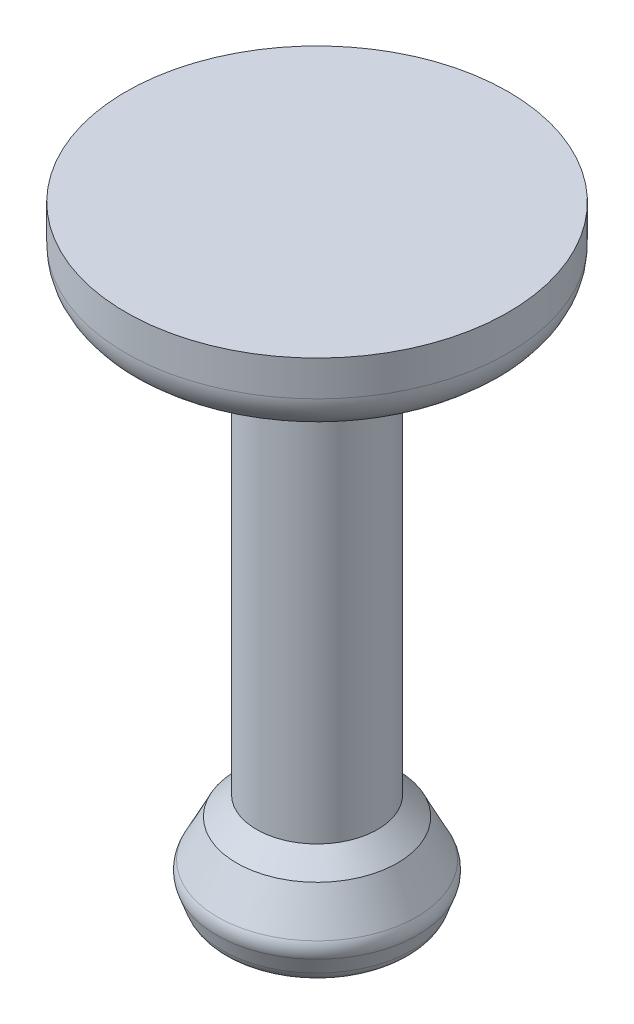
ISO-10303-21;
HEADER;
FILE_DESCRIPTION(('STEP AP214'),'2;1');
FILE_NAME('part.step','',(''),(''),'','','');
FILE_SCHEMA(('AUTOMOTIVE_DESIGN { 1 0 10303 214 1 1 1 1 }'));
ENDSEC;
DATA;
#1=APPLICATION_CONTEXT('core data for automotive mechanical design processes');
#2=APPLICATION_PROTOCOL_DEFINITION('international standard','automotive_design',2000,#1);
#3=PRODUCT_CONTEXT('',#1,'mechanical');
#4=PRODUCT('Part','Part','',(#3));
#5=PRODUCT_RELATED_PRODUCT_CATEGORY('part','',(#4));
#6=PRODUCT_DEFINITION_FORMATION('','',#4);
#7=PRODUCT_DEFINITION_CONTEXT('part definition',#1,'design');
#8=PRODUCT_DEFINITION('design','',#6,#7);
#9=PRODUCT_DEFINITION_SHAPE('','',#8);
#10=(LENGTH_UNIT() NAMED_UNIT(*) SI_UNIT(.MILLI.,.METRE.));
#11=(NAMED_UNIT(*) PLANE_ANGLE_UNIT() SI_UNIT($,.RADIAN.));
#12=(NAMED_UNIT(*) SI_UNIT($,.STERADIAN.) SOLID_ANGLE_UNIT());
#13=UNCERTAINTY_MEASURE_WITH_UNIT(LENGTH_MEASURE(1.E-05),#10,'distance_accuracy_value','');
#14=(GEOMETRIC_REPRESENTATION_CONTEXT(3) GLOBAL_UNCERTAINTY_ASSIGNED_CONTEXT((#13)) GLOBAL_UNIT_ASSIGNED_CONTEXT((#10,
#11,#12)) REPRESENTATION_CONTEXT('',''));
#15=CARTESIAN_POINT('',(0.,0.,0.));
#16=DIRECTION('',(0.,0.,1.));
#17=DIRECTION('',(1.,0.,0.));
#18=AXIS2_PLACEMENT_3D('',#15,#16,#17);
#19=CARTESIAN_POINT('',(-16.3863572176765,31.4329979687884,0.));
#20=DIRECTION('',(0.,-1.,0.));
#21=DIRECTION('',(0.,0.,-1.));
#22=AXIS2_PLACEMENT_3D('',#19,#20,#21);
#23=TOROIDAL_SURFACE('',#22,10.139599792567,2.54);
#24=CARTESIAN_POINT('',(-16.3863572176765,28.9227525536501,0.));
#25=DIRECTION('',(0.,-1.,0.));
#26=DIRECTION('',(0.,0.,-1.));
#27=AXIS2_PLACEMENT_3D('',#24,#25,#26);
#28=CIRCLE('',#27,10.5272439022569);
#29=CARTESIAN_POINT('',(-16.3863572176765,28.9227525536501,-10.5272439022569));
#30=VERTEX_POINT('',#29);
#31=EDGE_CURVE('E83',#30,#30,#28,.T.);
#32=ORIENTED_EDGE('',*,*,#31,.F.);
#33=EDGE_LOOP('',(#32));
#34=FACE_BOUND('',#33,.T.);
#35=CARTESIAN_POINT('',(-16.3863572176765,31.4329979687884,0.));
#36=DIRECTION('',(0.,-1.,0.));
#37=DIRECTION('',(0.,0.,-1.));
#38=AXIS2_PLACEMENT_3D('',#35,#36,#37);
#39=CIRCLE('',#38,12.679599792567);
#40=CARTESIAN_POINT('',(-16.3863572176765,31.4329979687884,-12.679599792567));
#41=VERTEX_POINT('',#40);
#42=EDGE_CURVE('E10',#41,#41,#39,.T.);
#43=ORIENTED_EDGE('',*,*,#42,.T.);
#44=EDGE_LOOP('',(#43));
#45=FACE_BOUND('',#44,.T.);
#46=ADVANCED_FACE('F31',(#34,#45),#23,.T.);
#47=CARTESIAN_POINT('',(-16.3863572176765,-3.05281870995184,0.));
#48=DIRECTION('',(0.,-1.,0.));
#49=DIRECTION('',(0.,0.,-1.));
#50=AXIS2_PLACEMENT_3D('',#47,#48,#49);
#51=CYLINDRICAL_SURFACE('',#50,12.679599792567);
#52=ORIENTED_EDGE('',*,*,#42,.F.);
#53=EDGE_LOOP('',(#52));
#54=FACE_BOUND('',#53,.T.);
#55=CARTESIAN_POINT('',(-16.3863572176765,33.7771812900482,0.));
#56=DIRECTION('',(0.,-1.,0.));
#57=DIRECTION('',(0.,0.,-1.));
#58=AXIS2_PLACEMENT_3D('',#55,#56,#57);
#59=CIRCLE('',#58,12.679599792567);
#60=CARTESIAN_POINT('',(-16.3863572176765,33.7771812900482,-12.679599792567));
#61=VERTEX_POINT('',#60);
#62=EDGE_CURVE('E37',#61,#61,#59,.T.);
#63=ORIENTED_EDGE('',*,*,#62,.T.);
#64=EDGE_LOOP('',(#63));
#65=FACE_BOUND('',#64,.T.);
#66=ADVANCED_FACE('F90',(#54,#65),#51,.T.);
#67=CARTESIAN_POINT('',(-16.3863572176765,33.7771812900482,0.));
#68=DIRECTION('',(0.,-1.,0.));
#69=DIRECTION('',(0.,0.,-1.));
#70=AXIS2_PLACEMENT_3D('',#67,#68,#69);
#71=PLANE('',#70);
#72=ORIENTED_EDGE('',*,*,#62,.F.);
#73=EDGE_LOOP('',(#72));
#74=FACE_BOUND('',#73,.T.);
#75=ADVANCED_FACE('F94',(#74),#71,.F.);
#76=CARTESIAN_POINT('',(-18.7859370531128,-3.05281870995184,0.));
#77=DIRECTION('',(0.,1.,0.));
#78=DIRECTION('',(0.,0.,1.));
#79=AXIS2_PLACEMENT_3D('',#76,#77,#78);
#80=PLANE('',#79);
#81=CARTESIAN_POINT('',(-16.3863572176765,-3.05281870995184,0.));
#82=DIRECTION('',(0.,-1.,0.));
#83=DIRECTION('',(0.,0.,-1.));
#84=AXIS2_PLACEMENT_3D('',#81,#82,#83);
#85=CIRCLE('',#84,2.39957983543637);
#86=CARTESIAN_POINT('',(-16.3863572176765,-3.05281870995184,-2.39957983543637));
#87=VERTEX_POINT('',#86);
#88=EDGE_CURVE('E41',#87,#87,#85,.T.);
#89=ORIENTED_EDGE('',*,*,#88,.T.);
#90=EDGE_LOOP('',(#89));
#91=FACE_BOUND('',#90,.T.);
#92=ADVANCED_FACE('F99',(#91),#80,.F.);
#93=CARTESIAN_POINT('',(-16.3863572176765,-4.32281870995184,0.));
#94=DIRECTION('',(0.,-1.,0.));
#95=DIRECTION('',(0.,0.,-1.));
#96=AXIS2_PLACEMENT_3D('',#93,#94,#95);
#97=TOROIDAL_SURFACE('',#96,2.39957983543638,1.27);
#98=ORIENTED_EDGE('',*,*,#88,.F.);
#99=EDGE_LOOP('',(#98));
#100=FACE_BOUND('',#99,.T.);
#101=CARTESIAN_POINT('',(-16.3863572176765,-3.90500514014736,0.));
#102=DIRECTION('',(0.,-1.,0.));
#103=DIRECTION('',(0.,0.,-1.));
#104=AXIS2_PLACEMENT_3D('',#101,#102,#103);
#105=CIRCLE('',#104,3.59888455938573);
#106=CARTESIAN_POINT('',(-16.3863572176765,-3.90500514014736,-3.59888455938573));
#107=VERTEX_POINT('',#106);
#108=EDGE_CURVE('E45',#107,#107,#105,.T.);
#109=ORIENTED_EDGE('',*,*,#108,.T.);
#110=EDGE_LOOP('',(#109));
#111=FACE_BOUND('',#110,.T.);
#112=ADVANCED_FACE('F105',(#100,#111),#97,.F.);
#113=CARTESIAN_POINT('',(-16.3863572176765,-4.64571703432303,0.));
#114=DIRECTION('',(0.,-1.,0.));
#115=DIRECTION('',(0.,0.,-1.));
#116=AXIS2_PLACEMENT_3D('',#113,#114,#115);
#117=CONICAL_SURFACE('',#116,3.85693363942525,0.335230727804483);
#118=ORIENTED_EDGE('',*,*,#108,.F.);
#119=EDGE_LOOP('',(#118));
#120=FACE_BOUND('',#119,.T.);
#121=CARTESIAN_POINT('',(-16.3863572176765,-4.64571703432303,0.));
#122=DIRECTION('',(0.,-1.,0.));
#123=DIRECTION('',(0.,0.,-1.));
#124=AXIS2_PLACEMENT_3D('',#121,#122,#123);
#125=CIRCLE('',#124,3.85693363942525);
#126=CARTESIAN_POINT('',(-16.3863572176765,-4.64571703432303,-3.85693363942525));
#127=VERTEX_POINT('',#126);
#128=EDGE_CURVE('E50',#127,#127,#125,.T.);
#129=ORIENTED_EDGE('',*,*,#128,.T.);
#130=EDGE_LOOP('',(#129));
#131=FACE_BOUND('',#130,.T.);
#132=ADVANCED_FACE('F109',(#120,#131),#117,.F.);
#133=CARTESIAN_POINT('',(-16.3863572176765,-5.06353060412752,0.));
#134=DIRECTION('',(0.,-1.,0.));
#135=DIRECTION('',(0.,0.,-1.));
#136=AXIS2_PLACEMENT_3D('',#133,#134,#135);
#137=TOROIDAL_SURFACE('',#136,2.6576289154759,1.27);
#138=ORIENTED_EDGE('',*,*,#128,.F.);
#139=EDGE_LOOP('',(#138));
#140=FACE_BOUND('',#139,.T.);
#141=CARTESIAN_POINT('',(-16.3863572176765,-5.68654307011768,0.));
#142=DIRECTION('',(0.,-1.,0.));
#143=DIRECTION('',(0.,0.,-1.));
#144=AXIS2_PLACEMENT_3D('',#141,#142,#143);
#145=CIRCLE('',#144,3.76431562237215);
#146=CARTESIAN_POINT('',(-16.3863572176765,-5.68654307011768,-3.76431562237215));
#147=VERTEX_POINT('',#146);
#148=EDGE_CURVE('E53',#147,#147,#145,.T.);
#149=ORIENTED_EDGE('',*,*,#148,.T.);
#150=EDGE_LOOP('',(#149));
#151=FACE_BOUND('',#150,.T.);
#152=ADVANCED_FACE('F113',(#140,#151),#137,.F.);
#153=CARTESIAN_POINT('',(-16.3863572176765,-6.92454374172193,0.));
#154=DIRECTION('',(0.,1.,0.));
#155=DIRECTION('',(0.,0.,1.));
#156=AXIS2_PLACEMENT_3D('',#153,#154,#155);
#157=CONICAL_SURFACE('',#156,3.06737958211125,0.512733419272507);
#158=ORIENTED_EDGE('',*,*,#148,.F.);
#159=EDGE_LOOP('',(#158));
#160=FACE_BOUND('',#159,.T.);
#161=CARTESIAN_POINT('',(-16.3863572176765,-6.92454374172193,0.));
#162=DIRECTION('',(0.,-1.,0.));
#163=DIRECTION('',(0.,0.,-1.));
#164=AXIS2_PLACEMENT_3D('',#161,#162,#163);
#165=CIRCLE('',#164,3.06737958211125);
#166=CARTESIAN_POINT('',(-16.3863572176765,-6.92454374172193,-3.06737958211125));
#167=VERTEX_POINT('',#166);
#168=EDGE_CURVE('E56',#167,#167,#165,.T.);
#169=ORIENTED_EDGE('',*,*,#168,.T.);
#170=EDGE_LOOP('',(#169));
#171=FACE_BOUND('',#170,.T.);
#172=ADVANCED_FACE('F117',(#160,#171),#157,.F.);
#173=CARTESIAN_POINT('',(-19.4537367997877,-6.92454374172193,0.));
#174=DIRECTION('',(0.,1.,0.));
#175=DIRECTION('',(0.,0.,1.));
#176=AXIS2_PLACEMENT_3D('',#173,#174,#175);
#177=PLANE('',#176);
#178=ORIENTED_EDGE('',*,*,#168,.F.);
#179=EDGE_LOOP('',(#178));
#180=FACE_BOUND('',#179,.T.);
#181=CARTESIAN_POINT('',(-16.3863572176765,-6.92454374172193,0.));
#182=DIRECTION('',(0.,-1.,0.));
#183=DIRECTION('',(0.,0.,-1.));
#184=AXIS2_PLACEMENT_3D('',#181,#182,#183);
#185=CIRCLE('',#184,5.07307046173878);
#186=CARTESIAN_POINT('',(-16.3863572176765,-6.92454374172193,-5.07307046173878));
#187=VERTEX_POINT('',#186);
#188=EDGE_CURVE('E59',#187,#187,#185,.T.);
#189=ORIENTED_EDGE('',*,*,#188,.T.);
#190=EDGE_LOOP('',(#189));
#191=FACE_BOUND('',#190,.T.);
#192=ADVANCED_FACE('F121',(#180,#191),#177,.F.);
#193=CARTESIAN_POINT('',(-16.3863572176765,-5.65454374172193,0.));
#194=DIRECTION('',(0.,-1.,0.));
#195=DIRECTION('',(0.,0.,-1.));
#196=AXIS2_PLACEMENT_3D('',#193,#194,#195);
#197=TOROIDAL_SURFACE('',#196,5.07307046173879,1.27);
#198=ORIENTED_EDGE('',*,*,#188,.F.);
#199=EDGE_LOOP('',(#198));
#200=FACE_BOUND('',#199,.T.);
#201=CARTESIAN_POINT('',(-16.3863572176765,-6.08752098190257,0.));
#202=DIRECTION('',(0.,-1.,0.));
#203=DIRECTION('',(0.,0.,-1.));
#204=AXIS2_PLACEMENT_3D('',#201,#202,#203);
#205=CIRCLE('',#204,6.26698449109164);
#206=CARTESIAN_POINT('',(-16.3863572176765,-6.08752098190257,-6.26698449109164));
#207=VERTEX_POINT('',#206);
#208=EDGE_CURVE('E62',#207,#207,#205,.T.);
#209=ORIENTED_EDGE('',*,*,#208,.T.);
#210=EDGE_LOOP('',(#209));
#211=FACE_BOUND('',#210,.T.);
#212=ADVANCED_FACE('F125',(#200,#211),#197,.T.);
#213=CARTESIAN_POINT('',(-16.3863572176765,-5.01426765466308,0.));
#214=DIRECTION('',(0.,1.,0.));
#215=DIRECTION('',(0.,0.,1.));
#216=AXIS2_PLACEMENT_3D('',#213,#214,#215);
#217=CONICAL_SURFACE('',#216,6.65620369131725,0.347902755749397);
#218=ORIENTED_EDGE('',*,*,#208,.F.);
#219=EDGE_LOOP('',(#218));
#220=FACE_BOUND('',#219,.T.);
#221=CARTESIAN_POINT('',(-16.3863572176765,-5.01426765466308,0.));
#222=DIRECTION('',(0.,-1.,0.));
#223=DIRECTION('',(0.,0.,-1.));
#224=AXIS2_PLACEMENT_3D('',#221,#222,#223);
#225=CIRCLE('',#224,6.65620369131725);
#226=CARTESIAN_POINT('',(-16.3863572176765,-5.01426765466308,-6.65620369131725));
#227=VERTEX_POINT('',#226);
#228=EDGE_CURVE('E65',#227,#227,#225,.T.);
#229=ORIENTED_EDGE('',*,*,#228,.T.);
#230=EDGE_LOOP('',(#229));
#231=FACE_BOUND('',#230,.T.);
#232=ADVANCED_FACE('F129',(#220,#231),#217,.T.);
#233=CARTESIAN_POINT('',(-16.3863572176765,-4.58129041448243,0.));
#234=DIRECTION('',(0.,-1.,0.));
#235=DIRECTION('',(0.,0.,-1.));
#236=AXIS2_PLACEMENT_3D('',#233,#234,#235);
#237=TOROIDAL_SURFACE('',#236,5.4622896619644,1.27);
#238=ORIENTED_EDGE('',*,*,#228,.F.);
#239=EDGE_LOOP('',(#238));
#240=FACE_BOUND('',#239,.T.);
#241=CARTESIAN_POINT('',(-16.3863572176765,-4.00459234573209,0.));
#242=DIRECTION('',(0.,-1.,0.));
#243=DIRECTION('',(0.,0.,-1.));
#244=AXIS2_PLACEMENT_3D('',#241,#242,#243);
#245=CIRCLE('',#244,6.59380163163138);
#246=CARTESIAN_POINT('',(-16.3863572176765,-4.00459234573209,-6.59380163163138));
#247=VERTEX_POINT('',#246);
#248=EDGE_CURVE('E68',#247,#247,#245,.T.);
#249=ORIENTED_EDGE('',*,*,#248,.T.);
#250=EDGE_LOOP('',(#249));
#251=FACE_BOUND('',#250,.T.);
#252=ADVANCED_FACE('F133',(#240,#251),#237,.T.);
#253=CARTESIAN_POINT('',(-16.3863572176765,-1.53045116874472,0.));
#254=DIRECTION('',(0.,-1.,0.));
#255=DIRECTION('',(0.,0.,-1.));
#256=AXIS2_PLACEMENT_3D('',#253,#254,#255);
#257=CONICAL_SURFACE('',#256,5.33280530385566,0.471353903686756);
#258=ORIENTED_EDGE('',*,*,#248,.F.);
#259=EDGE_LOOP('',(#258));
#260=FACE_BOUND('',#259,.T.);
#261=CARTESIAN_POINT('',(-16.3863572176765,-1.53045116874472,0.));
#262=DIRECTION('',(0.,-1.,0.));
#263=DIRECTION('',(0.,0.,-1.));
#264=AXIS2_PLACEMENT_3D('',#261,#262,#263);
#265=CIRCLE('',#264,5.33280530385566);
#266=CARTESIAN_POINT('',(-16.3863572176765,-1.53045116874472,-5.33280530385566));
#267=VERTEX_POINT('',#266);
#268=EDGE_CURVE('E71',#267,#267,#265,.T.);
#269=ORIENTED_EDGE('',*,*,#268,.T.);
#270=EDGE_LOOP('',(#269));
#271=FACE_BOUND('',#270,.T.);
#272=ADVANCED_FACE('F137',(#260,#271),#257,.T.);
#273=CARTESIAN_POINT('',(-16.3863572176765,-0.261393936880987,0.));
#274=DIRECTION('',(0.,-1.,0.));
#275=DIRECTION('',(0.,0.,-1.));
#276=AXIS2_PLACEMENT_3D('',#273,#274,#275);
#277=CONICAL_SURFACE('',#276,4.01387941853559,0.804665090726677);
#278=ORIENTED_EDGE('',*,*,#268,.F.);
#279=EDGE_LOOP('',(#278));
#280=FACE_BOUND('',#279,.T.);
#281=CARTESIAN_POINT('',(-16.3863572176765,-0.261393936880987,0.));
#282=DIRECTION('',(0.,-1.,0.));
#283=DIRECTION('',(0.,0.,-1.));
#284=AXIS2_PLACEMENT_3D('',#281,#282,#283);
#285=CIRCLE('',#284,4.01387941853559);
#286=CARTESIAN_POINT('',(-16.3863572176765,-0.261393936880987,-4.01387941853559));
#287=VERTEX_POINT('',#286);
#288=EDGE_CURVE('E74',#287,#287,#285,.T.);
#289=ORIENTED_EDGE('',*,*,#288,.T.);
#290=EDGE_LOOP('',(#289));
#291=FACE_BOUND('',#290,.T.);
#292=ADVANCED_FACE('F141',(#280,#291),#277,.T.);
#293=CARTESIAN_POINT('',(-16.3863572176765,-3.05281870995184,0.));
#294=DIRECTION('',(0.,-1.,0.));
#295=DIRECTION('',(0.,0.,-1.));
#296=AXIS2_PLACEMENT_3D('',#293,#294,#295);
#297=CYLINDRICAL_SURFACE('',#296,4.01387941853559);
#298=ORIENTED_EDGE('',*,*,#288,.F.);
#299=EDGE_LOOP('',(#298));
#300=FACE_BOUND('',#299,.T.);
#301=CARTESIAN_POINT('',(-16.3863572176765,25.7390593220761,0.));
#302=DIRECTION('',(0.,-1.,0.));
#303=DIRECTION('',(0.,0.,-1.));
#304=AXIS2_PLACEMENT_3D('',#301,#302,#303);
#305=CIRCLE('',#304,4.01387941853559);
#306=CARTESIAN_POINT('',(-16.3863572176765,25.7390593220761,-4.01387941853559));
#307=VERTEX_POINT('',#306);
#308=EDGE_CURVE('E77',#307,#307,#305,.T.);
#309=ORIENTED_EDGE('',*,*,#308,.T.);
#310=EDGE_LOOP('',(#309));
#311=FACE_BOUND('',#310,.T.);
#312=ADVANCED_FACE('F145',(#300,#311),#297,.T.);
#313=CARTESIAN_POINT('',(-16.3863572176765,25.7390593220761,0.));
#314=DIRECTION('',(0.,-1.,0.));
#315=DIRECTION('',(0.,0.,-1.));
#316=AXIS2_PLACEMENT_3D('',#313,#314,#315);
#317=TOROIDAL_SURFACE('',#316,6.55387941853559,2.54);
#318=ORIENTED_EDGE('',*,*,#308,.F.);
#319=EDGE_LOOP('',(#318));
#320=FACE_BOUND('',#319,.T.);
#321=CARTESIAN_POINT('',(-16.3863572176765,28.2493047372144,0.));
#322=DIRECTION('',(0.,-1.,0.));
#323=DIRECTION('',(0.,0.,-1.));
#324=AXIS2_PLACEMENT_3D('',#321,#322,#323);
#325=CIRCLE('',#324,6.16623530884576);
#326=CARTESIAN_POINT('',(-16.3863572176765,28.2493047372144,-6.16623530884576));
#327=VERTEX_POINT('',#326);
#328=EDGE_CURVE('E80',#327,#327,#325,.T.);
#329=ORIENTED_EDGE('',*,*,#328,.T.);
#330=EDGE_LOOP('',(#329));
#331=FACE_BOUND('',#330,.T.);
#332=ADVANCED_FACE('F149',(#320,#331),#317,.F.);
#333=CARTESIAN_POINT('',(-16.3863572176765,28.9227525536501,0.));
#334=DIRECTION('',(0.,1.,0.));
#335=DIRECTION('',(0.,0.,1.));
#336=AXIS2_PLACEMENT_3D('',#333,#334,#335);
#337=CONICAL_SURFACE('',#336,10.5272439022569,1.41758179476083);
#338=ORIENTED_EDGE('',*,*,#328,.F.);
#339=EDGE_LOOP('',(#338));
#340=FACE_BOUND('',#339,.T.);
#341=ORIENTED_EDGE('',*,*,#31,.T.);
#342=EDGE_LOOP('',(#341));
#343=FACE_BOUND('',#342,.T.);
#344=ADVANCED_FACE('F87',(#340,#343),#337,.T.);
#345=CLOSED_SHELL('',(#46,#66,#75,#92,#112,#132,#152,#172,#192,#212,#232,#252,#272,#292,#312,
#332,#344));
#346=MANIFOLD_SOLID_BREP('B2',#345);
#347=ADVANCED_BREP_SHAPE_REPRESENTATION('',(#18,#346),#14);
#348=SHAPE_DEFINITION_REPRESENTATION(#9,#347);
ENDSEC;
END-ISO-10303-21;
